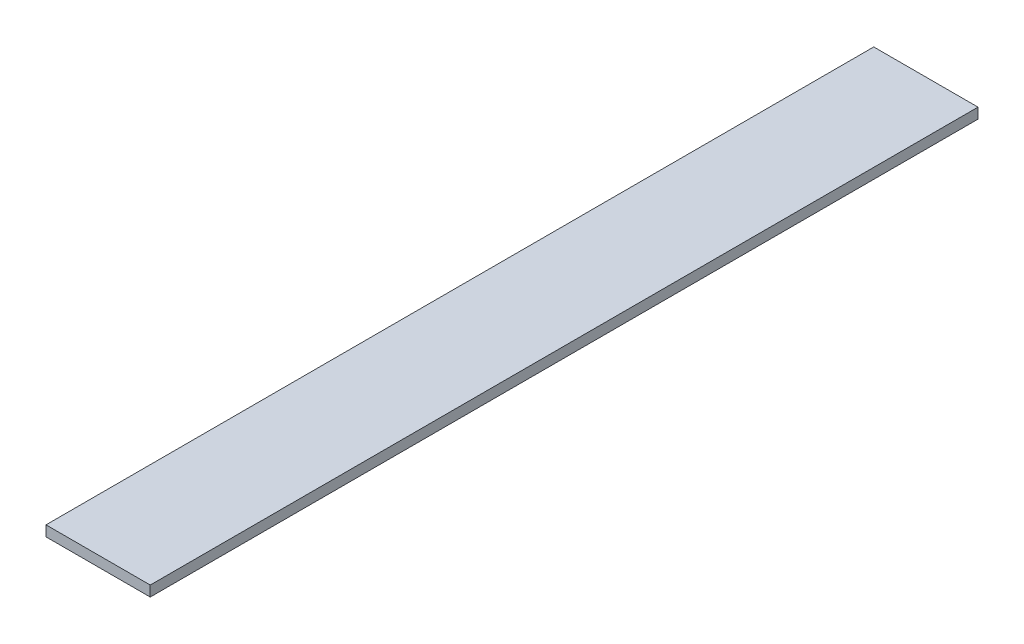
ISO-10303-21;
HEADER;
FILE_DESCRIPTION(('STEP AP214'),'2;1');
FILE_NAME('part.step','',(''),(''),'','','');
FILE_SCHEMA(('AUTOMOTIVE_DESIGN { 1 0 10303 214 1 1 1 1 }'));
ENDSEC;
DATA;
#1=APPLICATION_CONTEXT('core data for automotive mechanical design processes');
#2=APPLICATION_PROTOCOL_DEFINITION('international standard','automotive_design',2000,#1);
#3=PRODUCT_CONTEXT('',#1,'mechanical');
#4=PRODUCT('Part','Part','',(#3));
#5=PRODUCT_RELATED_PRODUCT_CATEGORY('part','',(#4));
#6=PRODUCT_DEFINITION_FORMATION('','',#4);
#7=PRODUCT_DEFINITION_CONTEXT('part definition',#1,'design');
#8=PRODUCT_DEFINITION('design','',#6,#7);
#9=PRODUCT_DEFINITION_SHAPE('','',#8);
#10=(LENGTH_UNIT() NAMED_UNIT(*) SI_UNIT(.MILLI.,.METRE.));
#11=(NAMED_UNIT(*) PLANE_ANGLE_UNIT() SI_UNIT($,.RADIAN.));
#12=(NAMED_UNIT(*) SI_UNIT($,.STERADIAN.) SOLID_ANGLE_UNIT());
#13=UNCERTAINTY_MEASURE_WITH_UNIT(LENGTH_MEASURE(1.E-05),#10,'distance_accuracy_value','');
#14=(GEOMETRIC_REPRESENTATION_CONTEXT(3) GLOBAL_UNCERTAINTY_ASSIGNED_CONTEXT((#13)) GLOBAL_UNIT_ASSIGNED_CONTEXT((#10,
#11,#12)) REPRESENTATION_CONTEXT('',''));
#15=CARTESIAN_POINT('',(0.,0.,0.));
#16=DIRECTION('',(0.,0.,1.));
#17=DIRECTION('',(1.,0.,0.));
#18=AXIS2_PLACEMENT_3D('',#15,#16,#17);
#19=CARTESIAN_POINT('',(0.,6.35,0.));
#20=DIRECTION('',(0.,-1.,0.));
#21=DIRECTION('',(0.,0.,-1.));
#22=AXIS2_PLACEMENT_3D('',#19,#20,#21);
#23=PLANE('',#22);
#24=DIRECTION('',(0.,0.,1.));
#25=VECTOR('',#24,1.);
#26=CARTESIAN_POINT('',(-465.,6.35,-277.5));
#27=LINE('',#26,#25);
#28=CARTESIAN_POINT('',(-465.,6.35,-252.1));
#29=VERTEX_POINT('',#28);
#30=CARTESIAN_POINT('',(-465.,6.35,252.1));
#31=VERTEX_POINT('',#30);
#32=EDGE_CURVE('E11',#29,#31,#27,.T.);
#33=ORIENTED_EDGE('',*,*,#32,.T.);
#34=DIRECTION('',(1.,0.,0.));
#35=VECTOR('',#34,1.);
#36=CARTESIAN_POINT('',(0.,6.35,252.1));
#37=LINE('',#36,#35);
#38=CARTESIAN_POINT('',(-401.5,6.35,252.1));
#39=VERTEX_POINT('',#38);
#40=EDGE_CURVE('E110',#31,#39,#37,.T.);
#41=ORIENTED_EDGE('',*,*,#40,.T.);
#42=DIRECTION('',(0.,0.,1.));
#43=VECTOR('',#42,1.);
#44=CARTESIAN_POINT('',(-401.5,6.35,-252.1));
#45=LINE('',#44,#43);
#46=CARTESIAN_POINT('',(-401.5,6.35,-252.1));
#47=VERTEX_POINT('',#46);
#48=EDGE_CURVE('E104',#47,#39,#45,.T.);
#49=ORIENTED_EDGE('',*,*,#48,.F.);
#50=DIRECTION('',(-1.,0.,0.));
#51=VECTOR('',#50,1.);
#52=CARTESIAN_POINT('',(0.,6.35,-252.1));
#53=LINE('',#52,#51);
#54=EDGE_CURVE('E55',#47,#29,#53,.T.);
#55=ORIENTED_EDGE('',*,*,#54,.T.);
#56=EDGE_LOOP('',(#33,#41,#49,#55));
#57=FACE_BOUND('',#56,.T.);
#58=ADVANCED_FACE('F39',(#57),#23,.F.);
#59=CARTESIAN_POINT('',(0.,0.,0.));
#60=DIRECTION('',(0.,-1.,0.));
#61=DIRECTION('',(0.,0.,-1.));
#62=AXIS2_PLACEMENT_3D('',#59,#60,#61);
#63=PLANE('',#62);
#64=DIRECTION('',(-1.,0.,0.));
#65=VECTOR('',#64,1.);
#66=CARTESIAN_POINT('',(-465.,0.,252.1));
#67=LINE('',#66,#65);
#68=CARTESIAN_POINT('',(-401.5,0.,252.1));
#69=VERTEX_POINT('',#68);
#70=CARTESIAN_POINT('',(-465.,0.,252.1));
#71=VERTEX_POINT('',#70);
#72=EDGE_CURVE('E85',#69,#71,#67,.T.);
#73=ORIENTED_EDGE('',*,*,#72,.T.);
#74=DIRECTION('',(0.,0.,1.));
#75=VECTOR('',#74,1.);
#76=CARTESIAN_POINT('',(-465.,0.,-277.5));
#77=LINE('',#76,#75);
#78=CARTESIAN_POINT('',(-465.,0.,-252.1));
#79=VERTEX_POINT('',#78);
#80=EDGE_CURVE('E43',#79,#71,#77,.T.);
#81=ORIENTED_EDGE('',*,*,#80,.F.);
#82=DIRECTION('',(1.,0.,0.));
#83=VECTOR('',#82,1.);
#84=CARTESIAN_POINT('',(-465.,0.,-252.1));
#85=LINE('',#84,#83);
#86=CARTESIAN_POINT('',(-401.5,0.,-252.1));
#87=VERTEX_POINT('',#86);
#88=EDGE_CURVE('E75',#79,#87,#85,.T.);
#89=ORIENTED_EDGE('',*,*,#88,.T.);
#90=DIRECTION('',(0.,0.,1.));
#91=VECTOR('',#90,1.);
#92=CARTESIAN_POINT('',(-401.5,0.,-252.1));
#93=LINE('',#92,#91);
#94=EDGE_CURVE('E107',#87,#69,#93,.T.);
#95=ORIENTED_EDGE('',*,*,#94,.T.);
#96=EDGE_LOOP('',(#73,#81,#89,#95));
#97=FACE_BOUND('',#96,.T.);
#98=ADVANCED_FACE('F95',(#97),#63,.T.);
#99=CARTESIAN_POINT('',(-465.,6.35,-277.5));
#100=DIRECTION('',(1.,0.,0.));
#101=DIRECTION('',(0.,0.,-1.));
#102=AXIS2_PLACEMENT_3D('',#99,#100,#101);
#103=PLANE('',#102);
#104=ORIENTED_EDGE('',*,*,#80,.T.);
#105=DIRECTION('',(0.,1.,0.));
#106=VECTOR('',#105,1.);
#107=CARTESIAN_POINT('',(-465.,0.,252.1));
#108=LINE('',#107,#106);
#109=EDGE_CURVE('E92',#71,#31,#108,.T.);
#110=ORIENTED_EDGE('',*,*,#109,.T.);
#111=ORIENTED_EDGE('',*,*,#32,.F.);
#112=DIRECTION('',(0.,1.,0.));
#113=VECTOR('',#112,1.);
#114=CARTESIAN_POINT('',(-465.,0.,-252.1));
#115=LINE('',#114,#113);
#116=EDGE_CURVE('E78',#79,#29,#115,.T.);
#117=ORIENTED_EDGE('',*,*,#116,.F.);
#118=EDGE_LOOP('',(#104,#110,#111,#117));
#119=FACE_BOUND('',#118,.T.);
#120=ADVANCED_FACE('F41',(#119),#103,.F.);
#121=CARTESIAN_POINT('',(-401.5,6.35,-252.1));
#122=DIRECTION('',(1.,0.,0.));
#123=DIRECTION('',(0.,0.,-1.));
#124=AXIS2_PLACEMENT_3D('',#121,#122,#123);
#125=PLANE('',#124);
#126=ORIENTED_EDGE('',*,*,#94,.F.);
#127=DIRECTION('',(0.,-1.,0.));
#128=VECTOR('',#127,1.);
#129=CARTESIAN_POINT('',(-401.5,6.35,-252.1));
#130=LINE('',#129,#128);
#131=EDGE_CURVE('E79',#47,#87,#130,.T.);
#132=ORIENTED_EDGE('',*,*,#131,.F.);
#133=ORIENTED_EDGE('',*,*,#48,.T.);
#134=DIRECTION('',(0.,-1.,0.));
#135=VECTOR('',#134,1.);
#136=CARTESIAN_POINT('',(-401.5,6.35,252.1));
#137=LINE('',#136,#135);
#138=EDGE_CURVE('E97',#39,#69,#137,.T.);
#139=ORIENTED_EDGE('',*,*,#138,.T.);
#140=EDGE_LOOP('',(#126,#132,#133,#139));
#141=FACE_BOUND('',#140,.T.);
#142=ADVANCED_FACE('F124',(#141),#125,.T.);
#143=CARTESIAN_POINT('',(-465.,0.,-252.1));
#144=DIRECTION('',(0.,0.,1.));
#145=DIRECTION('',(1.,0.,0.));
#146=AXIS2_PLACEMENT_3D('',#143,#144,#145);
#147=PLANE('',#146);
#148=ORIENTED_EDGE('',*,*,#131,.T.);
#149=ORIENTED_EDGE('',*,*,#88,.F.);
#150=ORIENTED_EDGE('',*,*,#116,.T.);
#151=ORIENTED_EDGE('',*,*,#54,.F.);
#152=EDGE_LOOP('',(#148,#149,#150,#151));
#153=FACE_BOUND('',#152,.T.);
#154=ADVANCED_FACE('F77',(#153),#147,.F.);
#155=CARTESIAN_POINT('',(-465.,0.,252.1));
#156=DIRECTION('',(0.,0.,-1.));
#157=DIRECTION('',(-1.,0.,0.));
#158=AXIS2_PLACEMENT_3D('',#155,#156,#157);
#159=PLANE('',#158);
#160=ORIENTED_EDGE('',*,*,#109,.F.);
#161=ORIENTED_EDGE('',*,*,#72,.F.);
#162=ORIENTED_EDGE('',*,*,#138,.F.);
#163=ORIENTED_EDGE('',*,*,#40,.F.);
#164=EDGE_LOOP('',(#160,#161,#162,#163));
#165=FACE_BOUND('',#164,.T.);
#166=ADVANCED_FACE('F131',(#165),#159,.F.);
#167=CLOSED_SHELL('',(#58,#98,#120,#142,#154,#166));
#168=MANIFOLD_SOLID_BREP('B2',#167);
#169=ADVANCED_BREP_SHAPE_REPRESENTATION('',(#18,#168),#14);
#170=SHAPE_DEFINITION_REPRESENTATION(#9,#169);
ENDSEC;
END-ISO-10303-21;
